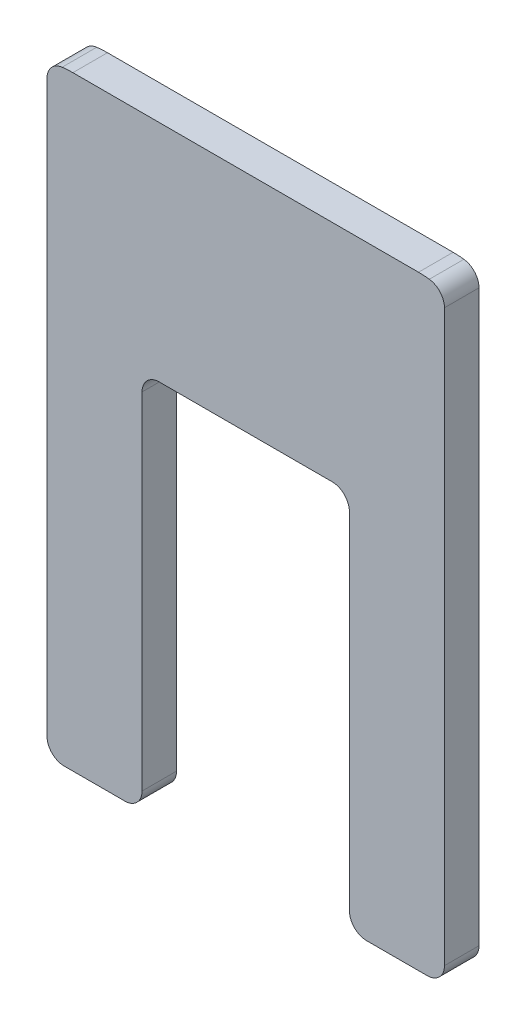
ISO-10303-21;
HEADER;
FILE_DESCRIPTION(('STEP AP214'),'2;1');
FILE_NAME('part.step','',(''),(''),'','','');
FILE_SCHEMA(('AUTOMOTIVE_DESIGN { 1 0 10303 214 1 1 1 1 }'));
ENDSEC;
DATA;
#1=APPLICATION_CONTEXT('core data for automotive mechanical design processes');
#2=APPLICATION_PROTOCOL_DEFINITION('international standard','automotive_design',2000,#1);
#3=PRODUCT_CONTEXT('',#1,'mechanical');
#4=PRODUCT('Part','Part','',(#3));
#5=PRODUCT_RELATED_PRODUCT_CATEGORY('part','',(#4));
#6=PRODUCT_DEFINITION_FORMATION('','',#4);
#7=PRODUCT_DEFINITION_CONTEXT('part definition',#1,'design');
#8=PRODUCT_DEFINITION('design','',#6,#7);
#9=PRODUCT_DEFINITION_SHAPE('','',#8);
#10=(LENGTH_UNIT() NAMED_UNIT(*) SI_UNIT(.MILLI.,.METRE.));
#11=(NAMED_UNIT(*) PLANE_ANGLE_UNIT() SI_UNIT($,.RADIAN.));
#12=(NAMED_UNIT(*) SI_UNIT($,.STERADIAN.) SOLID_ANGLE_UNIT());
#13=UNCERTAINTY_MEASURE_WITH_UNIT(LENGTH_MEASURE(1.E-05),#10,'distance_accuracy_value','');
#14=(GEOMETRIC_REPRESENTATION_CONTEXT(3) GLOBAL_UNCERTAINTY_ASSIGNED_CONTEXT((#13)) GLOBAL_UNIT_ASSIGNED_CONTEXT((#10,
#11,#12)) REPRESENTATION_CONTEXT('',''));
#15=CARTESIAN_POINT('',(0.,0.,0.));
#16=DIRECTION('',(0.,0.,1.));
#17=DIRECTION('',(1.,0.,0.));
#18=AXIS2_PLACEMENT_3D('',#15,#16,#17);
#19=CARTESIAN_POINT('',(0.,0.,2.));
#20=DIRECTION('',(0.,1.,0.));
#21=DIRECTION('',(0.,0.,1.));
#22=AXIS2_PLACEMENT_3D('',#19,#20,#21);
#23=PLANE('',#22);
#24=DIRECTION('',(1.,0.,0.));
#25=VECTOR('',#24,1.);
#26=CARTESIAN_POINT('',(0.,0.,0.));
#27=LINE('',#26,#25);
#28=CARTESIAN_POINT('',(1.,0.,0.));
#29=VERTEX_POINT('',#28);
#30=CARTESIAN_POINT('',(4.5,0.,0.));
#31=VERTEX_POINT('',#30);
#32=EDGE_CURVE('E197',#29,#31,#27,.T.);
#33=ORIENTED_EDGE('',*,*,#32,.T.);
#34=DIRECTION('',(0.,0.,1.));
#35=VECTOR('',#34,1.);
#36=CARTESIAN_POINT('',(4.5,0.,2.));
#37=LINE('',#36,#35);
#38=CARTESIAN_POINT('',(4.5,0.,2.));
#39=VERTEX_POINT('',#38);
#40=EDGE_CURVE('E254',#31,#39,#37,.T.);
#41=ORIENTED_EDGE('',*,*,#40,.T.);
#42=DIRECTION('',(1.,0.,0.));
#43=VECTOR('',#42,1.);
#44=CARTESIAN_POINT('',(0.,0.,2.));
#45=LINE('',#44,#43);
#46=CARTESIAN_POINT('',(1.,0.,2.));
#47=VERTEX_POINT('',#46);
#48=EDGE_CURVE('E311',#47,#39,#45,.T.);
#49=ORIENTED_EDGE('',*,*,#48,.F.);
#50=DIRECTION('',(0.,0.,-1.));
#51=VECTOR('',#50,1.);
#52=CARTESIAN_POINT('',(1.,0.,2.));
#53=LINE('',#52,#51);
#54=EDGE_CURVE('E224',#47,#29,#53,.T.);
#55=ORIENTED_EDGE('',*,*,#54,.T.);
#56=EDGE_LOOP('',(#33,#41,#49,#55));
#57=FACE_BOUND('',#56,.T.);
#58=ADVANCED_FACE('F33',(#57),#23,.F.);
#59=CARTESIAN_POINT('',(1.5,30.,2.));
#60=DIRECTION('',(0.,0.,-1.));
#61=DIRECTION('',(-1.,0.,0.));
#62=AXIS2_PLACEMENT_3D('',#59,#60,#61);
#63=PLANE('',#62);
#64=ORIENTED_EDGE('',*,*,#48,.T.);
#65=CARTESIAN_POINT('',(4.5,1.,2.));
#66=DIRECTION('',(0.,0.,-1.));
#67=DIRECTION('',(-1.,0.,0.));
#68=AXIS2_PLACEMENT_3D('',#65,#66,#67);
#69=CIRCLE('',#68,1.);
#70=CARTESIAN_POINT('',(5.5,1.,2.));
#71=VERTEX_POINT('',#70);
#72=EDGE_CURVE('E259',#39,#71,#69,.F.);
#73=ORIENTED_EDGE('',*,*,#72,.T.);
#74=DIRECTION('',(0.,1.,0.));
#75=VECTOR('',#74,1.);
#76=CARTESIAN_POINT('',(5.5,0.,2.));
#77=LINE('',#76,#75);
#78=CARTESIAN_POINT('',(5.5,21.,2.));
#79=VERTEX_POINT('',#78);
#80=EDGE_CURVE('E288',#71,#79,#77,.T.);
#81=ORIENTED_EDGE('',*,*,#80,.T.);
#82=CARTESIAN_POINT('',(6.5,21.,2.));
#83=DIRECTION('',(0.,0.,-1.));
#84=DIRECTION('',(-1.,0.,0.));
#85=AXIS2_PLACEMENT_3D('',#82,#83,#84);
#86=CIRCLE('',#85,1.);
#87=CARTESIAN_POINT('',(6.5,22.,2.));
#88=VERTEX_POINT('',#87);
#89=EDGE_CURVE('E41',#79,#88,#86,.T.);
#90=ORIENTED_EDGE('',*,*,#89,.T.);
#91=DIRECTION('',(1.,0.,0.));
#92=VECTOR('',#91,1.);
#93=CARTESIAN_POINT('',(5.5,22.,2.));
#94=LINE('',#93,#92);
#95=CARTESIAN_POINT('',(16.5,22.,2.));
#96=VERTEX_POINT('',#95);
#97=EDGE_CURVE('E286',#88,#96,#94,.T.);
#98=ORIENTED_EDGE('',*,*,#97,.T.);
#99=CARTESIAN_POINT('',(16.5,21.,2.));
#100=DIRECTION('',(0.,0.,-1.));
#101=DIRECTION('',(-1.,0.,0.));
#102=AXIS2_PLACEMENT_3D('',#99,#100,#101);
#103=CIRCLE('',#102,1.);
#104=CARTESIAN_POINT('',(17.5,21.,2.));
#105=VERTEX_POINT('',#104);
#106=EDGE_CURVE('E280',#96,#105,#103,.T.);
#107=ORIENTED_EDGE('',*,*,#106,.T.);
#108=DIRECTION('',(0.,1.,0.));
#109=VECTOR('',#108,1.);
#110=CARTESIAN_POINT('',(17.5,0.,2.));
#111=LINE('',#110,#109);
#112=CARTESIAN_POINT('',(17.5,1.,2.));
#113=VERTEX_POINT('',#112);
#114=EDGE_CURVE('E196',#113,#105,#111,.T.);
#115=ORIENTED_EDGE('',*,*,#114,.F.);
#116=CARTESIAN_POINT('',(18.5,1.,2.));
#117=DIRECTION('',(0.,0.,-1.));
#118=DIRECTION('',(-1.,0.,0.));
#119=AXIS2_PLACEMENT_3D('',#116,#117,#118);
#120=CIRCLE('',#119,1.);
#121=CARTESIAN_POINT('',(18.5,0.,2.));
#122=VERTEX_POINT('',#121);
#123=EDGE_CURVE('E257',#113,#122,#120,.F.);
#124=ORIENTED_EDGE('',*,*,#123,.T.);
#125=CARTESIAN_POINT('',(22.,0.,2.));
#126=VERTEX_POINT('',#125);
#127=EDGE_CURVE('E329',#122,#126,#45,.T.);
#128=ORIENTED_EDGE('',*,*,#127,.T.);
#129=CARTESIAN_POINT('',(22.,1.,2.));
#130=DIRECTION('',(0.,0.,-1.));
#131=DIRECTION('',(-1.,0.,0.));
#132=AXIS2_PLACEMENT_3D('',#129,#130,#131);
#133=CIRCLE('',#132,1.);
#134=CARTESIAN_POINT('',(23.,1.,2.));
#135=VERTEX_POINT('',#134);
#136=EDGE_CURVE('E235',#126,#135,#133,.F.);
#137=ORIENTED_EDGE('',*,*,#136,.T.);
#138=DIRECTION('',(0.,1.,0.));
#139=VECTOR('',#138,1.);
#140=CARTESIAN_POINT('',(23.,0.,2.));
#141=LINE('',#140,#139);
#142=CARTESIAN_POINT('',(23.,33.9686269665969,2.));
#143=VERTEX_POINT('',#142);
#144=EDGE_CURVE('E172',#135,#143,#141,.T.);
#145=ORIENTED_EDGE('',*,*,#144,.T.);
#146=CARTESIAN_POINT('',(22.,33.9686269665969,2.));
#147=DIRECTION('',(0.,0.,-1.));
#148=DIRECTION('',(-1.,0.,0.));
#149=AXIS2_PLACEMENT_3D('',#146,#147,#148);
#150=CIRCLE('',#149,1.);
#151=CARTESIAN_POINT('',(22.125,34.9607837082461,2.));
#152=VERTEX_POINT('',#151);
#153=EDGE_CURVE('E168',#143,#152,#150,.F.);
#154=ORIENTED_EDGE('',*,*,#153,.T.);
#155=CARTESIAN_POINT('',(21.5,30.,2.));
#156=DIRECTION('',(0.,0.,1.));
#157=DIRECTION('',(1.,0.,0.));
#158=AXIS2_PLACEMENT_3D('',#155,#156,#157);
#159=CIRCLE('',#158,5.);
#160=CARTESIAN_POINT('',(21.5,35.,2.));
#161=VERTEX_POINT('',#160);
#162=EDGE_CURVE('E158',#152,#161,#159,.T.);
#163=ORIENTED_EDGE('',*,*,#162,.T.);
#164=DIRECTION('',(-1.,0.,0.));
#165=VECTOR('',#164,1.);
#166=CARTESIAN_POINT('',(1.5,35.,2.));
#167=LINE('',#166,#165);
#168=CARTESIAN_POINT('',(1.5,35.,2.));
#169=VERTEX_POINT('',#168);
#170=EDGE_CURVE('E164',#161,#169,#167,.T.);
#171=ORIENTED_EDGE('',*,*,#170,.T.);
#172=CARTESIAN_POINT('',(1.5,30.,2.));
#173=DIRECTION('',(0.,0.,1.));
#174=DIRECTION('',(-1.,0.,0.));
#175=AXIS2_PLACEMENT_3D('',#172,#173,#174);
#176=CIRCLE('',#175,5.);
#177=CARTESIAN_POINT('',(0.874999999999999,34.9607837082461,2.));
#178=VERTEX_POINT('',#177);
#179=EDGE_CURVE('E187',#169,#178,#176,.T.);
#180=ORIENTED_EDGE('',*,*,#179,.T.);
#181=CARTESIAN_POINT('',(1.,33.9686269665969,2.));
#182=DIRECTION('',(0.,0.,-1.));
#183=DIRECTION('',(-1.,0.,0.));
#184=AXIS2_PLACEMENT_3D('',#181,#182,#183);
#185=CIRCLE('',#184,1.);
#186=CARTESIAN_POINT('',(0.,33.9686269665969,2.));
#187=VERTEX_POINT('',#186);
#188=EDGE_CURVE('E231',#178,#187,#185,.F.);
#189=ORIENTED_EDGE('',*,*,#188,.T.);
#190=DIRECTION('',(0.,-1.,0.));
#191=VECTOR('',#190,1.);
#192=CARTESIAN_POINT('',(0.,0.,2.));
#193=LINE('',#192,#191);
#194=CARTESIAN_POINT('',(0.,1.,2.));
#195=VERTEX_POINT('',#194);
#196=EDGE_CURVE('E209',#187,#195,#193,.T.);
#197=ORIENTED_EDGE('',*,*,#196,.T.);
#198=CARTESIAN_POINT('',(1.,1.,2.));
#199=DIRECTION('',(0.,0.,-1.));
#200=DIRECTION('',(-1.,0.,0.));
#201=AXIS2_PLACEMENT_3D('',#198,#199,#200);
#202=CIRCLE('',#201,1.);
#203=EDGE_CURVE('E233',#195,#47,#202,.F.);
#204=ORIENTED_EDGE('',*,*,#203,.T.);
#205=EDGE_LOOP('',(#64,#73,#81,#90,#98,#107,#115,#124,#128,#137,#145,#154,#163,#171,#180,#189,
#197,#204));
#206=FACE_BOUND('',#205,.T.);
#207=ADVANCED_FACE('F161',(#206),#63,.F.);
#208=CARTESIAN_POINT('',(1.5,30.,0.));
#209=DIRECTION('',(0.,0.,-1.));
#210=DIRECTION('',(-1.,0.,0.));
#211=AXIS2_PLACEMENT_3D('',#208,#209,#210);
#212=PLANE('',#211);
#213=DIRECTION('',(0.,-1.,0.));
#214=VECTOR('',#213,1.);
#215=CARTESIAN_POINT('',(5.5,30.,0.));
#216=LINE('',#215,#214);
#217=CARTESIAN_POINT('',(5.5,21.,0.));
#218=VERTEX_POINT('',#217);
#219=CARTESIAN_POINT('',(5.5,1.,0.));
#220=VERTEX_POINT('',#219);
#221=EDGE_CURVE('E251',#218,#220,#216,.T.);
#222=ORIENTED_EDGE('',*,*,#221,.T.);
#223=CARTESIAN_POINT('',(4.5,1.,0.));
#224=DIRECTION('',(0.,0.,-1.));
#225=DIRECTION('',(-1.,0.,0.));
#226=AXIS2_PLACEMENT_3D('',#223,#224,#225);
#227=CIRCLE('',#226,1.);
#228=EDGE_CURVE('E267',#220,#31,#227,.T.);
#229=ORIENTED_EDGE('',*,*,#228,.T.);
#230=ORIENTED_EDGE('',*,*,#32,.F.);
#231=CARTESIAN_POINT('',(1.,1.,0.));
#232=DIRECTION('',(0.,0.,-1.));
#233=DIRECTION('',(-1.,0.,0.));
#234=AXIS2_PLACEMENT_3D('',#231,#232,#233);
#235=CIRCLE('',#234,1.);
#236=CARTESIAN_POINT('',(0.,1.,0.));
#237=VERTEX_POINT('',#236);
#238=EDGE_CURVE('E219',#29,#237,#235,.T.);
#239=ORIENTED_EDGE('',*,*,#238,.T.);
#240=DIRECTION('',(0.,-1.,0.));
#241=VECTOR('',#240,1.);
#242=CARTESIAN_POINT('',(0.,0.,0.));
#243=LINE('',#242,#241);
#244=CARTESIAN_POINT('',(0.,33.9686269665969,0.));
#245=VERTEX_POINT('',#244);
#246=EDGE_CURVE('E192',#245,#237,#243,.T.);
#247=ORIENTED_EDGE('',*,*,#246,.F.);
#248=CARTESIAN_POINT('',(1.,33.9686269665969,0.));
#249=DIRECTION('',(0.,0.,-1.));
#250=DIRECTION('',(-1.,0.,0.));
#251=AXIS2_PLACEMENT_3D('',#248,#249,#250);
#252=CIRCLE('',#251,1.);
#253=CARTESIAN_POINT('',(0.874999999999999,34.9607837082461,0.));
#254=VERTEX_POINT('',#253);
#255=EDGE_CURVE('E217',#245,#254,#252,.T.);
#256=ORIENTED_EDGE('',*,*,#255,.T.);
#257=CARTESIAN_POINT('',(1.5,30.,0.));
#258=DIRECTION('',(0.,0.,1.));
#259=DIRECTION('',(-1.,0.,0.));
#260=AXIS2_PLACEMENT_3D('',#257,#258,#259);
#261=CIRCLE('',#260,5.);
#262=CARTESIAN_POINT('',(1.5,35.,0.));
#263=VERTEX_POINT('',#262);
#264=EDGE_CURVE('E206',#263,#254,#261,.T.);
#265=ORIENTED_EDGE('',*,*,#264,.F.);
#266=DIRECTION('',(-1.,0.,0.));
#267=VECTOR('',#266,1.);
#268=CARTESIAN_POINT('',(1.5,35.,0.));
#269=LINE('',#268,#267);
#270=CARTESIAN_POINT('',(21.5,35.,0.));
#271=VERTEX_POINT('',#270);
#272=EDGE_CURVE('E204',#271,#263,#269,.T.);
#273=ORIENTED_EDGE('',*,*,#272,.F.);
#274=CARTESIAN_POINT('',(21.5,30.,0.));
#275=DIRECTION('',(0.,0.,1.));
#276=DIRECTION('',(1.,0.,0.));
#277=AXIS2_PLACEMENT_3D('',#274,#275,#276);
#278=CIRCLE('',#277,5.);
#279=CARTESIAN_POINT('',(22.125,34.9607837082461,0.));
#280=VERTEX_POINT('',#279);
#281=EDGE_CURVE('E178',#280,#271,#278,.T.);
#282=ORIENTED_EDGE('',*,*,#281,.F.);
#283=CARTESIAN_POINT('',(22.,33.9686269665969,0.));
#284=DIRECTION('',(0.,0.,-1.));
#285=DIRECTION('',(-1.,0.,0.));
#286=AXIS2_PLACEMENT_3D('',#283,#284,#285);
#287=CIRCLE('',#286,1.);
#288=CARTESIAN_POINT('',(23.,33.9686269665969,0.));
#289=VERTEX_POINT('',#288);
#290=EDGE_CURVE('E215',#280,#289,#287,.T.);
#291=ORIENTED_EDGE('',*,*,#290,.T.);
#292=DIRECTION('',(0.,1.,0.));
#293=VECTOR('',#292,1.);
#294=CARTESIAN_POINT('',(23.,0.,0.));
#295=LINE('',#294,#293);
#296=CARTESIAN_POINT('',(23.,1.,0.));
#297=VERTEX_POINT('',#296);
#298=EDGE_CURVE('E200',#297,#289,#295,.T.);
#299=ORIENTED_EDGE('',*,*,#298,.F.);
#300=CARTESIAN_POINT('',(22.,1.,0.));
#301=DIRECTION('',(0.,0.,-1.));
#302=DIRECTION('',(-1.,0.,0.));
#303=AXIS2_PLACEMENT_3D('',#300,#301,#302);
#304=CIRCLE('',#303,1.);
#305=CARTESIAN_POINT('',(22.,0.,0.));
#306=VERTEX_POINT('',#305);
#307=EDGE_CURVE('E221',#297,#306,#304,.T.);
#308=ORIENTED_EDGE('',*,*,#307,.T.);
#309=CARTESIAN_POINT('',(18.5,0.,0.));
#310=VERTEX_POINT('',#309);
#311=EDGE_CURVE('E195',#310,#306,#27,.T.);
#312=ORIENTED_EDGE('',*,*,#311,.F.);
#313=CARTESIAN_POINT('',(18.5,1.,0.));
#314=DIRECTION('',(0.,0.,-1.));
#315=DIRECTION('',(-1.,0.,0.));
#316=AXIS2_PLACEMENT_3D('',#313,#314,#315);
#317=CIRCLE('',#316,1.);
#318=CARTESIAN_POINT('',(17.5,1.,0.));
#319=VERTEX_POINT('',#318);
#320=EDGE_CURVE('E48',#310,#319,#317,.T.);
#321=ORIENTED_EDGE('',*,*,#320,.T.);
#322=DIRECTION('',(0.,-1.,0.));
#323=VECTOR('',#322,1.);
#324=CARTESIAN_POINT('',(17.5,30.,0.));
#325=LINE('',#324,#323);
#326=CARTESIAN_POINT('',(17.5,21.,0.));
#327=VERTEX_POINT('',#326);
#328=EDGE_CURVE('E246',#327,#319,#325,.T.);
#329=ORIENTED_EDGE('',*,*,#328,.F.);
#330=CARTESIAN_POINT('',(16.5,21.,0.));
#331=DIRECTION('',(0.,0.,-1.));
#332=DIRECTION('',(-1.,0.,0.));
#333=AXIS2_PLACEMENT_3D('',#330,#331,#332);
#334=CIRCLE('',#333,1.);
#335=CARTESIAN_POINT('',(16.5,22.,0.));
#336=VERTEX_POINT('',#335);
#337=EDGE_CURVE('E282',#327,#336,#334,.F.);
#338=ORIENTED_EDGE('',*,*,#337,.T.);
#339=DIRECTION('',(-1.,0.,0.));
#340=VECTOR('',#339,1.);
#341=CARTESIAN_POINT('',(1.5,22.,0.));
#342=LINE('',#341,#340);
#343=CARTESIAN_POINT('',(6.5,22.,0.));
#344=VERTEX_POINT('',#343);
#345=EDGE_CURVE('E248',#336,#344,#342,.T.);
#346=ORIENTED_EDGE('',*,*,#345,.T.);
#347=CARTESIAN_POINT('',(6.5,21.,0.));
#348=DIRECTION('',(0.,0.,-1.));
#349=DIRECTION('',(-1.,0.,0.));
#350=AXIS2_PLACEMENT_3D('',#347,#348,#349);
#351=CIRCLE('',#350,1.);
#352=EDGE_CURVE('E11',#344,#218,#351,.F.);
#353=ORIENTED_EDGE('',*,*,#352,.T.);
#354=EDGE_LOOP('',(#222,#229,#230,#239,#247,#256,#265,#273,#282,#291,#299,#308,#312,#321,#329,
#338,#346,#353));
#355=FACE_BOUND('',#354,.T.);
#356=ADVANCED_FACE('F299',(#355),#212,.T.);
#357=CARTESIAN_POINT('',(0.,0.,2.));
#358=DIRECTION('',(1.,0.,0.));
#359=DIRECTION('',(0.,1.,0.));
#360=AXIS2_PLACEMENT_3D('',#357,#358,#359);
#361=PLANE('',#360);
#362=ORIENTED_EDGE('',*,*,#246,.T.);
#363=DIRECTION('',(0.,0.,-1.));
#364=VECTOR('',#363,1.);
#365=CARTESIAN_POINT('',(0.,1.,2.));
#366=LINE('',#365,#364);
#367=EDGE_CURVE('E240',#237,#195,#366,.F.);
#368=ORIENTED_EDGE('',*,*,#367,.T.);
#369=ORIENTED_EDGE('',*,*,#196,.F.);
#370=DIRECTION('',(0.,0.,-1.));
#371=VECTOR('',#370,1.);
#372=CARTESIAN_POINT('',(0.,33.9686269665969,2.));
#373=LINE('',#372,#371);
#374=EDGE_CURVE('E237',#187,#245,#373,.T.);
#375=ORIENTED_EDGE('',*,*,#374,.T.);
#376=EDGE_LOOP('',(#362,#368,#369,#375));
#377=FACE_BOUND('',#376,.T.);
#378=ADVANCED_FACE('F318',(#377),#361,.F.);
#379=ORIENTED_EDGE('',*,*,#127,.F.);
#380=DIRECTION('',(0.,0.,1.));
#381=VECTOR('',#380,1.);
#382=CARTESIAN_POINT('',(18.5,0.,2.));
#383=LINE('',#382,#381);
#384=EDGE_CURVE('E273',#122,#310,#383,.F.);
#385=ORIENTED_EDGE('',*,*,#384,.T.);
#386=ORIENTED_EDGE('',*,*,#311,.T.);
#387=DIRECTION('',(0.,0.,-1.));
#388=VECTOR('',#387,1.);
#389=CARTESIAN_POINT('',(22.,0.,2.));
#390=LINE('',#389,#388);
#391=EDGE_CURVE('E227',#306,#126,#390,.F.);
#392=ORIENTED_EDGE('',*,*,#391,.T.);
#393=EDGE_LOOP('',(#379,#385,#386,#392));
#394=FACE_BOUND('',#393,.T.);
#395=ADVANCED_FACE('F364',(#394),#23,.F.);
#396=CARTESIAN_POINT('',(23.,0.,2.));
#397=DIRECTION('',(-1.,0.,0.));
#398=DIRECTION('',(0.,0.,1.));
#399=AXIS2_PLACEMENT_3D('',#396,#397,#398);
#400=PLANE('',#399);
#401=ORIENTED_EDGE('',*,*,#144,.F.);
#402=DIRECTION('',(0.,0.,-1.));
#403=VECTOR('',#402,1.);
#404=CARTESIAN_POINT('',(23.,1.,2.));
#405=LINE('',#404,#403);
#406=EDGE_CURVE('E212',#135,#297,#405,.T.);
#407=ORIENTED_EDGE('',*,*,#406,.T.);
#408=ORIENTED_EDGE('',*,*,#298,.T.);
#409=DIRECTION('',(0.,0.,-1.));
#410=VECTOR('',#409,1.);
#411=CARTESIAN_POINT('',(23.,33.9686269665969,2.));
#412=LINE('',#411,#410);
#413=EDGE_CURVE('E181',#289,#143,#412,.F.);
#414=ORIENTED_EDGE('',*,*,#413,.T.);
#415=EDGE_LOOP('',(#401,#407,#408,#414));
#416=FACE_BOUND('',#415,.T.);
#417=ADVANCED_FACE('F341',(#416),#400,.F.);
#418=CARTESIAN_POINT('',(21.5,30.,2.));
#419=DIRECTION('',(0.,0.,-1.));
#420=DIRECTION('',(-1.,0.,0.));
#421=AXIS2_PLACEMENT_3D('',#418,#419,#420);
#422=CYLINDRICAL_SURFACE('',#421,5.);
#423=ORIENTED_EDGE('',*,*,#162,.F.);
#424=DIRECTION('',(0.,0.,-1.));
#425=VECTOR('',#424,1.);
#426=CARTESIAN_POINT('',(22.125,34.9607837082461,2.));
#427=LINE('',#426,#425);
#428=EDGE_CURVE('E244',#152,#280,#427,.T.);
#429=ORIENTED_EDGE('',*,*,#428,.T.);
#430=ORIENTED_EDGE('',*,*,#281,.T.);
#431=DIRECTION('',(0.,0.,-1.));
#432=VECTOR('',#431,1.);
#433=CARTESIAN_POINT('',(21.5,35.,2.));
#434=LINE('',#433,#432);
#435=EDGE_CURVE('E175',#161,#271,#434,.T.);
#436=ORIENTED_EDGE('',*,*,#435,.F.);
#437=EDGE_LOOP('',(#423,#429,#430,#436));
#438=FACE_BOUND('',#437,.T.);
#439=ADVANCED_FACE('F176',(#438),#422,.T.);
#440=CARTESIAN_POINT('',(1.5,35.,2.));
#441=DIRECTION('',(0.,-1.,0.));
#442=DIRECTION('',(0.,0.,-1.));
#443=AXIS2_PLACEMENT_3D('',#440,#441,#442);
#444=PLANE('',#443);
#445=ORIENTED_EDGE('',*,*,#272,.T.);
#446=DIRECTION('',(0.,0.,-1.));
#447=VECTOR('',#446,1.);
#448=CARTESIAN_POINT('',(1.5,35.,2.));
#449=LINE('',#448,#447);
#450=EDGE_CURVE('E182',#169,#263,#449,.T.);
#451=ORIENTED_EDGE('',*,*,#450,.F.);
#452=ORIENTED_EDGE('',*,*,#170,.F.);
#453=ORIENTED_EDGE('',*,*,#435,.T.);
#454=EDGE_LOOP('',(#445,#451,#452,#453));
#455=FACE_BOUND('',#454,.T.);
#456=ADVANCED_FACE('F184',(#455),#444,.F.);
#457=CARTESIAN_POINT('',(1.5,30.,2.));
#458=DIRECTION('',(0.,0.,-1.));
#459=DIRECTION('',(-1.,0.,0.));
#460=AXIS2_PLACEMENT_3D('',#457,#458,#459);
#461=CYLINDRICAL_SURFACE('',#460,5.);
#462=ORIENTED_EDGE('',*,*,#264,.T.);
#463=DIRECTION('',(0.,0.,-1.));
#464=VECTOR('',#463,1.);
#465=CARTESIAN_POINT('',(0.874999999999999,34.9607837082461,2.));
#466=LINE('',#465,#464);
#467=EDGE_CURVE('E242',#254,#178,#466,.F.);
#468=ORIENTED_EDGE('',*,*,#467,.T.);
#469=ORIENTED_EDGE('',*,*,#179,.F.);
#470=ORIENTED_EDGE('',*,*,#450,.T.);
#471=EDGE_LOOP('',(#462,#468,#469,#470));
#472=FACE_BOUND('',#471,.T.);
#473=ADVANCED_FACE('F328',(#472),#461,.T.);
#474=CARTESIAN_POINT('',(22.,1.,2.));
#475=DIRECTION('',(0.,0.,-1.));
#476=DIRECTION('',(-1.,0.,0.));
#477=AXIS2_PLACEMENT_3D('',#474,#475,#476);
#478=CYLINDRICAL_SURFACE('',#477,1.);
#479=ORIENTED_EDGE('',*,*,#136,.F.);
#480=ORIENTED_EDGE('',*,*,#391,.F.);
#481=ORIENTED_EDGE('',*,*,#307,.F.);
#482=ORIENTED_EDGE('',*,*,#406,.F.);
#483=EDGE_LOOP('',(#479,#480,#481,#482));
#484=FACE_BOUND('',#483,.T.);
#485=ADVANCED_FACE('F343',(#484),#478,.T.);
#486=CARTESIAN_POINT('',(1.,1.,2.));
#487=DIRECTION('',(0.,0.,-1.));
#488=DIRECTION('',(-1.,0.,0.));
#489=AXIS2_PLACEMENT_3D('',#486,#487,#488);
#490=CYLINDRICAL_SURFACE('',#489,1.);
#491=ORIENTED_EDGE('',*,*,#203,.F.);
#492=ORIENTED_EDGE('',*,*,#367,.F.);
#493=ORIENTED_EDGE('',*,*,#238,.F.);
#494=ORIENTED_EDGE('',*,*,#54,.F.);
#495=EDGE_LOOP('',(#491,#492,#493,#494));
#496=FACE_BOUND('',#495,.T.);
#497=ADVANCED_FACE('F314',(#496),#490,.T.);
#498=CARTESIAN_POINT('',(1.,33.9686269665969,2.));
#499=DIRECTION('',(0.,0.,-1.));
#500=DIRECTION('',(-1.,0.,0.));
#501=AXIS2_PLACEMENT_3D('',#498,#499,#500);
#502=CYLINDRICAL_SURFACE('',#501,1.);
#503=ORIENTED_EDGE('',*,*,#188,.F.);
#504=ORIENTED_EDGE('',*,*,#467,.F.);
#505=ORIENTED_EDGE('',*,*,#255,.F.);
#506=ORIENTED_EDGE('',*,*,#374,.F.);
#507=EDGE_LOOP('',(#503,#504,#505,#506));
#508=FACE_BOUND('',#507,.T.);
#509=ADVANCED_FACE('F324',(#508),#502,.T.);
#510=CARTESIAN_POINT('',(22.,33.9686269665969,2.));
#511=DIRECTION('',(0.,0.,-1.));
#512=DIRECTION('',(-1.,0.,0.));
#513=AXIS2_PLACEMENT_3D('',#510,#511,#512);
#514=CYLINDRICAL_SURFACE('',#513,1.);
#515=ORIENTED_EDGE('',*,*,#153,.F.);
#516=ORIENTED_EDGE('',*,*,#413,.F.);
#517=ORIENTED_EDGE('',*,*,#290,.F.);
#518=ORIENTED_EDGE('',*,*,#428,.F.);
#519=EDGE_LOOP('',(#515,#516,#517,#518));
#520=FACE_BOUND('',#519,.T.);
#521=ADVANCED_FACE('F339',(#520),#514,.T.);
#522=CARTESIAN_POINT('',(5.5,0.,-8.));
#523=DIRECTION('',(1.,0.,0.));
#524=DIRECTION('',(0.,0.,-1.));
#525=AXIS2_PLACEMENT_3D('',#522,#523,#524);
#526=PLANE('',#525);
#527=ORIENTED_EDGE('',*,*,#80,.F.);
#528=DIRECTION('',(0.,0.,1.));
#529=VECTOR('',#528,1.);
#530=CARTESIAN_POINT('',(5.5,1.,0.));
#531=LINE('',#530,#529);
#532=EDGE_CURVE('E264',#71,#220,#531,.F.);
#533=ORIENTED_EDGE('',*,*,#532,.T.);
#534=ORIENTED_EDGE('',*,*,#221,.F.);
#535=DIRECTION('',(0.,0.,1.));
#536=VECTOR('',#535,1.);
#537=CARTESIAN_POINT('',(5.5,21.,2.));
#538=LINE('',#537,#536);
#539=EDGE_CURVE('E261',#218,#79,#538,.T.);
#540=ORIENTED_EDGE('',*,*,#539,.T.);
#541=EDGE_LOOP('',(#527,#533,#534,#540));
#542=FACE_BOUND('',#541,.T.);
#543=ADVANCED_FACE('F302',(#542),#526,.T.);
#544=CARTESIAN_POINT('',(5.5,22.,-8.));
#545=DIRECTION('',(0.,-1.,0.));
#546=DIRECTION('',(1.,0.,0.));
#547=AXIS2_PLACEMENT_3D('',#544,#545,#546);
#548=PLANE('',#547);
#549=ORIENTED_EDGE('',*,*,#345,.F.);
#550=DIRECTION('',(0.,0.,1.));
#551=VECTOR('',#550,1.);
#552=CARTESIAN_POINT('',(16.5,22.,-8.));
#553=LINE('',#552,#551);
#554=EDGE_CURVE('E277',#336,#96,#553,.T.);
#555=ORIENTED_EDGE('',*,*,#554,.T.);
#556=ORIENTED_EDGE('',*,*,#97,.F.);
#557=DIRECTION('',(0.,0.,1.));
#558=VECTOR('',#557,1.);
#559=CARTESIAN_POINT('',(6.5,22.,0.));
#560=LINE('',#559,#558);
#561=EDGE_CURVE('E275',#88,#344,#560,.F.);
#562=ORIENTED_EDGE('',*,*,#561,.T.);
#563=EDGE_LOOP('',(#549,#555,#556,#562));
#564=FACE_BOUND('',#563,.T.);
#565=ADVANCED_FACE('F294',(#564),#548,.T.);
#566=CARTESIAN_POINT('',(17.5,0.,-8.));
#567=DIRECTION('',(1.,0.,0.));
#568=DIRECTION('',(0.,1.,0.));
#569=AXIS2_PLACEMENT_3D('',#566,#567,#568);
#570=PLANE('',#569);
#571=ORIENTED_EDGE('',*,*,#328,.T.);
#572=DIRECTION('',(0.,0.,1.));
#573=VECTOR('',#572,1.);
#574=CARTESIAN_POINT('',(17.5,1.,-8.));
#575=LINE('',#574,#573);
#576=EDGE_CURVE('E270',#319,#113,#575,.T.);
#577=ORIENTED_EDGE('',*,*,#576,.T.);
#578=ORIENTED_EDGE('',*,*,#114,.T.);
#579=DIRECTION('',(0.,0.,1.));
#580=VECTOR('',#579,1.);
#581=CARTESIAN_POINT('',(17.5,21.,-8.));
#582=LINE('',#581,#580);
#583=EDGE_CURVE('E55',#105,#327,#582,.F.);
#584=ORIENTED_EDGE('',*,*,#583,.T.);
#585=EDGE_LOOP('',(#571,#577,#578,#584));
#586=FACE_BOUND('',#585,.T.);
#587=ADVANCED_FACE('F351',(#586),#570,.F.);
#588=CARTESIAN_POINT('',(4.5,1.,2.));
#589=DIRECTION('',(0.,0.,-1.));
#590=DIRECTION('',(-1.,0.,0.));
#591=AXIS2_PLACEMENT_3D('',#588,#589,#590);
#592=CYLINDRICAL_SURFACE('',#591,1.);
#593=ORIENTED_EDGE('',*,*,#228,.F.);
#594=ORIENTED_EDGE('',*,*,#532,.F.);
#595=ORIENTED_EDGE('',*,*,#72,.F.);
#596=ORIENTED_EDGE('',*,*,#40,.F.);
#597=EDGE_LOOP('',(#593,#594,#595,#596));
#598=FACE_BOUND('',#597,.T.);
#599=ADVANCED_FACE('F305',(#598),#592,.T.);
#600=CARTESIAN_POINT('',(18.5,1.,-8.));
#601=DIRECTION('',(0.,0.,1.));
#602=DIRECTION('',(1.,0.,0.));
#603=AXIS2_PLACEMENT_3D('',#600,#601,#602);
#604=CYLINDRICAL_SURFACE('',#603,1.);
#605=ORIENTED_EDGE('',*,*,#320,.F.);
#606=ORIENTED_EDGE('',*,*,#384,.F.);
#607=ORIENTED_EDGE('',*,*,#123,.F.);
#608=ORIENTED_EDGE('',*,*,#576,.F.);
#609=EDGE_LOOP('',(#605,#606,#607,#608));
#610=FACE_BOUND('',#609,.T.);
#611=ADVANCED_FACE('F349',(#610),#604,.T.);
#612=CARTESIAN_POINT('',(16.5,21.,-8.));
#613=DIRECTION('',(0.,0.,1.));
#614=DIRECTION('',(1.,0.,0.));
#615=AXIS2_PLACEMENT_3D('',#612,#613,#614);
#616=CYLINDRICAL_SURFACE('',#615,1.);
#617=ORIENTED_EDGE('',*,*,#337,.F.);
#618=ORIENTED_EDGE('',*,*,#583,.F.);
#619=ORIENTED_EDGE('',*,*,#106,.F.);
#620=ORIENTED_EDGE('',*,*,#554,.F.);
#621=EDGE_LOOP('',(#617,#618,#619,#620));
#622=FACE_BOUND('',#621,.T.);
#623=ADVANCED_FACE('F355',(#622),#616,.F.);
#624=CARTESIAN_POINT('',(6.5,21.,-8.));
#625=DIRECTION('',(0.,0.,-1.));
#626=DIRECTION('',(-1.,0.,0.));
#627=AXIS2_PLACEMENT_3D('',#624,#625,#626);
#628=CYLINDRICAL_SURFACE('',#627,1.);
#629=ORIENTED_EDGE('',*,*,#352,.F.);
#630=ORIENTED_EDGE('',*,*,#561,.F.);
#631=ORIENTED_EDGE('',*,*,#89,.F.);
#632=ORIENTED_EDGE('',*,*,#539,.F.);
#633=EDGE_LOOP('',(#629,#630,#631,#632));
#634=FACE_BOUND('',#633,.T.);
#635=ADVANCED_FACE('F35',(#634),#628,.F.);
#636=CLOSED_SHELL('',(#58,#207,#356,#378,#395,#417,#439,#456,#473,#485,#497,#509,#521,#543,#565,
#587,#599,#611,#623,#635));
#637=MANIFOLD_SOLID_BREP('B2',#636);
#638=ADVANCED_BREP_SHAPE_REPRESENTATION('',(#18,#637),#14);
#639=SHAPE_DEFINITION_REPRESENTATION(#9,#638);
ENDSEC;
END-ISO-10303-21;
